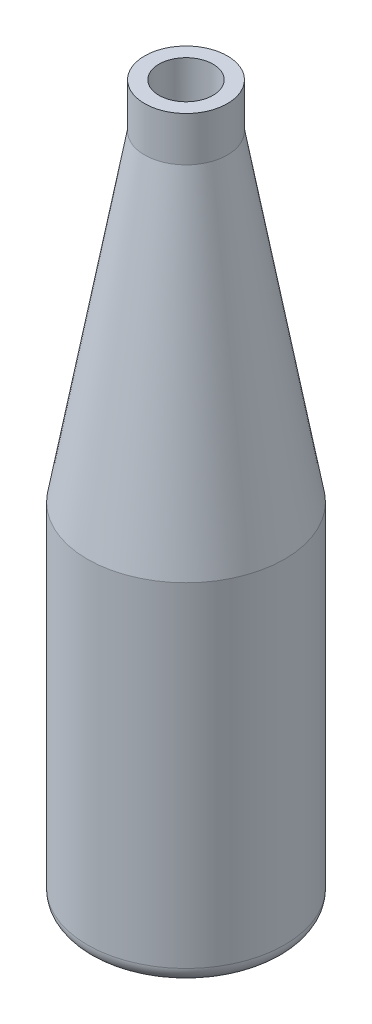
ISO-10303-21;
HEADER;
FILE_DESCRIPTION(('STEP AP214'),'2;1');
FILE_NAME('part.step','',(''),(''),'','','');
FILE_SCHEMA(('AUTOMOTIVE_DESIGN { 1 0 10303 214 1 1 1 1 }'));
ENDSEC;
DATA;
#1=APPLICATION_CONTEXT('core data for automotive mechanical design processes');
#2=APPLICATION_PROTOCOL_DEFINITION('international standard','automotive_design',2000,#1);
#3=PRODUCT_CONTEXT('',#1,'mechanical');
#4=PRODUCT('Part','Part','',(#3));
#5=PRODUCT_RELATED_PRODUCT_CATEGORY('part','',(#4));
#6=PRODUCT_DEFINITION_FORMATION('','',#4);
#7=PRODUCT_DEFINITION_CONTEXT('part definition',#1,'design');
#8=PRODUCT_DEFINITION('design','',#6,#7);
#9=PRODUCT_DEFINITION_SHAPE('','',#8);
#10=(LENGTH_UNIT() NAMED_UNIT(*) SI_UNIT(.MILLI.,.METRE.));
#11=(NAMED_UNIT(*) PLANE_ANGLE_UNIT() SI_UNIT($,.RADIAN.));
#12=(NAMED_UNIT(*) SI_UNIT($,.STERADIAN.) SOLID_ANGLE_UNIT());
#13=UNCERTAINTY_MEASURE_WITH_UNIT(LENGTH_MEASURE(1.E-05),#10,'distance_accuracy_value','');
#14=(GEOMETRIC_REPRESENTATION_CONTEXT(3) GLOBAL_UNCERTAINTY_ASSIGNED_CONTEXT((#13)) GLOBAL_UNIT_ASSIGNED_CONTEXT((#10,
#11,#12)) REPRESENTATION_CONTEXT('',''));
#15=CARTESIAN_POINT('',(0.,0.,0.));
#16=DIRECTION('',(0.,0.,1.));
#17=DIRECTION('',(1.,0.,0.));
#18=AXIS2_PLACEMENT_3D('',#15,#16,#17);
#19=CARTESIAN_POINT('',(0.,225.,0.));
#20=DIRECTION('',(0.,1.,0.));
#21=DIRECTION('',(-1.,0.,0.));
#22=AXIS2_PLACEMENT_3D('',#19,#20,#21);
#23=CYLINDRICAL_SURFACE('',#22,31.);
#24=CARTESIAN_POINT('',(0.,110.,0.));
#25=DIRECTION('',(0.,1.,0.));
#26=DIRECTION('',(-1.,0.,0.));
#27=AXIS2_PLACEMENT_3D('',#24,#25,#26);
#28=CIRCLE('',#27,31.);
#29=CARTESIAN_POINT('',(-31.,110.,0.));
#30=VERTEX_POINT('',#29);
#31=EDGE_CURVE('E10',#30,#30,#28,.T.);
#32=ORIENTED_EDGE('',*,*,#31,.F.);
#33=EDGE_LOOP('',(#32));
#34=FACE_BOUND('',#33,.T.);
#35=CARTESIAN_POINT('',(0.,5.,0.));
#36=DIRECTION('',(0.,1.,0.));
#37=DIRECTION('',(-1.,0.,0.));
#38=AXIS2_PLACEMENT_3D('',#35,#36,#37);
#39=CIRCLE('',#38,31.);
#40=CARTESIAN_POINT('',(-31.,5.,0.));
#41=VERTEX_POINT('',#40);
#42=EDGE_CURVE('E80',#41,#41,#39,.T.);
#43=ORIENTED_EDGE('',*,*,#42,.T.);
#44=EDGE_LOOP('',(#43));
#45=FACE_BOUND('',#44,.T.);
#46=ADVANCED_FACE('F37',(#34,#45),#23,.T.);
#47=CARTESIAN_POINT('',(0.,110.,0.));
#48=DIRECTION('',(0.,-1.,0.));
#49=DIRECTION('',(1.,0.,0.));
#50=AXIS2_PLACEMENT_3D('',#47,#48,#49);
#51=CONICAL_SURFACE('',#50,31.,0.176366155603672);
#52=CARTESIAN_POINT('',(0.,211.,0.));
#53=DIRECTION('',(0.,1.,0.));
#54=DIRECTION('',(-1.,0.,0.));
#55=AXIS2_PLACEMENT_3D('',#52,#53,#54);
#56=CIRCLE('',#55,13.);
#57=CARTESIAN_POINT('',(-13.,211.,0.));
#58=VERTEX_POINT('',#57);
#59=EDGE_CURVE('E44',#58,#58,#56,.T.);
#60=ORIENTED_EDGE('',*,*,#59,.F.);
#61=EDGE_LOOP('',(#60));
#62=FACE_BOUND('',#61,.T.);
#63=ORIENTED_EDGE('',*,*,#31,.T.);
#64=EDGE_LOOP('',(#63));
#65=FACE_BOUND('',#64,.T.);
#66=ADVANCED_FACE('F103',(#62,#65),#51,.T.);
#67=CARTESIAN_POINT('',(0.,225.,0.));
#68=DIRECTION('',(0.,1.,0.));
#69=DIRECTION('',(-1.,0.,0.));
#70=AXIS2_PLACEMENT_3D('',#67,#68,#69);
#71=CYLINDRICAL_SURFACE('',#70,13.);
#72=CARTESIAN_POINT('',(0.,225.,0.));
#73=DIRECTION('',(0.,1.,0.));
#74=DIRECTION('',(-1.,0.,0.));
#75=AXIS2_PLACEMENT_3D('',#72,#73,#74);
#76=CIRCLE('',#75,13.);
#77=CARTESIAN_POINT('',(-13.,225.,0.));
#78=VERTEX_POINT('',#77);
#79=EDGE_CURVE('E49',#78,#78,#76,.T.);
#80=ORIENTED_EDGE('',*,*,#79,.F.);
#81=EDGE_LOOP('',(#80));
#82=FACE_BOUND('',#81,.T.);
#83=ORIENTED_EDGE('',*,*,#59,.T.);
#84=EDGE_LOOP('',(#83));
#85=FACE_BOUND('',#84,.T.);
#86=ADVANCED_FACE('F108',(#82,#85),#71,.T.);
#87=CARTESIAN_POINT('',(-13.,225.,0.));
#88=DIRECTION('',(0.,-1.,0.));
#89=DIRECTION('',(1.,0.,0.));
#90=AXIS2_PLACEMENT_3D('',#87,#88,#89);
#91=PLANE('',#90);
#92=CARTESIAN_POINT('',(0.,225.,0.));
#93=DIRECTION('',(0.,1.,0.));
#94=DIRECTION('',(-1.,0.,0.));
#95=AXIS2_PLACEMENT_3D('',#92,#93,#94);
#96=CIRCLE('',#95,8.49999999999999);
#97=CARTESIAN_POINT('',(-8.5,225.,0.));
#98=VERTEX_POINT('',#97);
#99=EDGE_CURVE('E54',#98,#98,#96,.T.);
#100=ORIENTED_EDGE('',*,*,#99,.F.);
#101=EDGE_LOOP('',(#100));
#102=FACE_BOUND('',#101,.T.);
#103=ORIENTED_EDGE('',*,*,#79,.T.);
#104=EDGE_LOOP('',(#103));
#105=FACE_BOUND('',#104,.T.);
#106=ADVANCED_FACE('F113',(#102,#105),#91,.F.);
#107=CARTESIAN_POINT('',(0.,225.,0.));
#108=DIRECTION('',(0.,1.,0.));
#109=DIRECTION('',(-1.,0.,0.));
#110=AXIS2_PLACEMENT_3D('',#107,#108,#109);
#111=CYLINDRICAL_SURFACE('',#110,8.49999999999999);
#112=ORIENTED_EDGE('',*,*,#99,.T.);
#113=EDGE_LOOP('',(#112));
#114=FACE_BOUND('',#113,.T.);
#115=CARTESIAN_POINT('',(0.,210.602144339146,0.));
#116=DIRECTION('',(0.,1.,0.));
#117=DIRECTION('',(-1.,0.,0.));
#118=AXIS2_PLACEMENT_3D('',#115,#116,#117);
#119=CIRCLE('',#118,8.49999999999999);
#120=CARTESIAN_POINT('',(8.49999999999998,210.602144339146,0.));
#121=VERTEX_POINT('',#120);
#122=EDGE_CURVE('E60',#121,#121,#119,.T.);
#123=ORIENTED_EDGE('',*,*,#122,.F.);
#124=EDGE_LOOP('',(#123));
#125=FACE_BOUND('',#124,.T.);
#126=ADVANCED_FACE('F119',(#114,#125),#111,.F.);
#127=CARTESIAN_POINT('',(0.,109.602144339146,0.));
#128=DIRECTION('',(0.,-1.,0.));
#129=DIRECTION('',(1.,0.,0.));
#130=AXIS2_PLACEMENT_3D('',#127,#128,#129);
#131=CONICAL_SURFACE('',#130,26.5,0.176366155603672);
#132=CARTESIAN_POINT('',(0.,109.602144339146,0.));
#133=DIRECTION('',(0.,1.,0.));
#134=DIRECTION('',(-1.,0.,0.));
#135=AXIS2_PLACEMENT_3D('',#132,#133,#134);
#136=CIRCLE('',#135,26.5);
#137=CARTESIAN_POINT('',(26.5,109.602144339146,0.));
#138=VERTEX_POINT('',#137);
#139=EDGE_CURVE('E64',#138,#138,#136,.T.);
#140=CARTESIAN_POINT('',(8.49999999999998,210.602144339146,0.));
#141=CARTESIAN_POINT('',(8.68749999999998,209.550061005813,0.));
#142=CARTESIAN_POINT('',(8.87499999999998,208.497977672479,0.));
#143=CARTESIAN_POINT('',(9.24999999999998,206.393811005813,0.));
#144=CARTESIAN_POINT('',(9.43749999999998,205.341727672479,0.));
#145=CARTESIAN_POINT('',(9.81249999999998,203.237561005813,0.));
#146=CARTESIAN_POINT('',(9.99999999999999,202.185477672479,0.));
#147=CARTESIAN_POINT('',(10.375,200.081311005813,0.));
#148=CARTESIAN_POINT('',(10.5625,199.029227672479,0.));
#149=CARTESIAN_POINT('',(10.9375,196.925061005813,0.));
#150=CARTESIAN_POINT('',(11.125,195.872977672479,0.));
#151=CARTESIAN_POINT('',(11.5,193.768811005813,0.));
#152=CARTESIAN_POINT('',(11.6875,192.716727672479,0.));
#153=CARTESIAN_POINT('',(12.0625,190.612561005813,0.));
#154=CARTESIAN_POINT('',(12.25,189.560477672479,0.));
#155=CARTESIAN_POINT('',(12.625,187.456311005813,0.));
#156=CARTESIAN_POINT('',(12.8125,186.404227672479,0.));
#157=CARTESIAN_POINT('',(13.1875,184.300061005813,0.));
#158=CARTESIAN_POINT('',(13.375,183.247977672479,0.));
#159=CARTESIAN_POINT('',(13.75,181.143811005813,0.));
#160=CARTESIAN_POINT('',(13.9375,180.091727672479,0.));
#161=CARTESIAN_POINT('',(14.3125,177.987561005813,0.));
#162=CARTESIAN_POINT('',(14.5,176.935477672479,0.));
#163=CARTESIAN_POINT('',(14.875,174.831311005813,0.));
#164=CARTESIAN_POINT('',(15.0625,173.779227672479,0.));
#165=CARTESIAN_POINT('',(15.4375,171.675061005813,0.));
#166=CARTESIAN_POINT('',(15.625,170.622977672479,0.));
#167=CARTESIAN_POINT('',(16.,168.518811005813,0.));
#168=CARTESIAN_POINT('',(16.1875,167.466727672479,0.));
#169=CARTESIAN_POINT('',(16.5625,165.362561005813,0.));
#170=CARTESIAN_POINT('',(16.75,164.310477672479,0.));
#171=CARTESIAN_POINT('',(17.125,162.206311005813,0.));
#172=CARTESIAN_POINT('',(17.3125,161.154227672479,0.));
#173=CARTESIAN_POINT('',(17.6875,159.050061005813,0.));
#174=CARTESIAN_POINT('',(17.875,157.997977672479,0.));
#175=CARTESIAN_POINT('',(18.25,155.893811005813,0.));
#176=CARTESIAN_POINT('',(18.4375,154.841727672479,0.));
#177=CARTESIAN_POINT('',(18.8125,152.737561005813,0.));
#178=CARTESIAN_POINT('',(19.,151.685477672479,0.));
#179=CARTESIAN_POINT('',(19.375,149.581311005813,0.));
#180=CARTESIAN_POINT('',(19.5625,148.529227672479,0.));
#181=CARTESIAN_POINT('',(19.9375,146.425061005813,0.));
#182=CARTESIAN_POINT('',(20.125,145.372977672479,0.));
#183=CARTESIAN_POINT('',(20.5,143.268811005813,0.));
#184=CARTESIAN_POINT('',(20.6875,142.216727672479,0.));
#185=CARTESIAN_POINT('',(21.0625,140.112561005813,0.));
#186=CARTESIAN_POINT('',(21.25,139.060477672479,0.));
#187=CARTESIAN_POINT('',(21.625,136.956311005813,0.));
#188=CARTESIAN_POINT('',(21.8125,135.904227672479,0.));
#189=CARTESIAN_POINT('',(22.1875,133.800061005813,0.));
#190=CARTESIAN_POINT('',(22.375,132.747977672479,0.));
#191=CARTESIAN_POINT('',(22.75,130.643811005813,0.));
#192=CARTESIAN_POINT('',(22.9375,129.591727672479,0.));
#193=CARTESIAN_POINT('',(23.3125,127.487561005813,0.));
#194=CARTESIAN_POINT('',(23.5,126.435477672479,0.));
#195=CARTESIAN_POINT('',(23.875,124.331311005813,0.));
#196=CARTESIAN_POINT('',(24.0625,123.279227672479,0.));
#197=CARTESIAN_POINT('',(24.4375,121.175061005813,0.));
#198=CARTESIAN_POINT('',(24.625,120.122977672479,0.));
#199=CARTESIAN_POINT('',(25.,118.018811005813,0.));
#200=CARTESIAN_POINT('',(25.1875,116.966727672479,0.));
#201=CARTESIAN_POINT('',(25.5625,114.862561005813,0.));
#202=CARTESIAN_POINT('',(25.75,113.810477672479,0.));
#203=CARTESIAN_POINT('',(26.125,111.706311005813,0.));
#204=CARTESIAN_POINT('',(26.3125,110.654227672479,0.));
#205=CARTESIAN_POINT('',(26.5,109.602144339146,0.));
#206=B_SPLINE_CURVE_WITH_KNOTS('',3,(#140,#141,#142,#143,#144,#145,#146,#147,#148,#149,#150,
#151,#152,#153,#154,#155,#156,#157,#158,#159,#160,#161,#162,#163,#164,#165,#166,#167,#168,#169,
#170,#171,#172,#173,#174,#175,#176,#177,#178,#179,#180,#181,#182,#183,#184,#185,#186,#187,#188,
#189,#190,#191,#192,#193,#194,#195,#196,#197,#198,#199,#200,#201,#202,#203,#204,#205),
.UNSPECIFIED.,.F.,.F.,(4,2,2,2,2,2,2,2,2,2,2,2,2,2,2,2,2,2,2,2,2,2,2,2,2,2,2,2,2,2,2,2,4),(0.,
3.20598195760675,6.4119639152135,9.61794587282025,12.823927830427,16.0299097880337,
19.2358917456405,22.4418737032473,25.647855660854,28.8538376184608,32.0598195760675,
35.2658015336743,38.471783491281,41.6777654488878,44.8837474064945,48.0897293641013,
51.295711321708,54.5016932793148,57.7076752369215,60.9136571945283,64.119639152135,
67.3256211097418,70.5316030673485,73.7375850249553,76.943566982562,80.1495489401688,
83.3555308977756,86.5615128553823,89.7674948129891,92.9734767705958,96.1794587282026,
99.3854406858093,102.591422643416),.UNSPECIFIED.);
#207=EDGE_CURVE('BSEAM123',#121,#138,#206,.T.);
#208=ORIENTED_EDGE('',*,*,#122,.T.);
#209=ORIENTED_EDGE('',*,*,#139,.F.);
#210=ORIENTED_EDGE('',*,*,#207,.T.);
#211=ORIENTED_EDGE('',*,*,#207,.F.);
#212=EDGE_LOOP('',(#208,#210,#209,#211));
#213=FACE_BOUND('',#212,.T.);
#214=ADVANCED_FACE('F123',(#213),#131,.F.);
#215=CARTESIAN_POINT('',(0.,225.,0.));
#216=DIRECTION('',(0.,1.,0.));
#217=DIRECTION('',(-1.,0.,0.));
#218=AXIS2_PLACEMENT_3D('',#215,#216,#217);
#219=CYLINDRICAL_SURFACE('',#218,26.5);
#220=ORIENTED_EDGE('',*,*,#139,.T.);
#221=EDGE_LOOP('',(#220));
#222=FACE_BOUND('',#221,.T.);
#223=CARTESIAN_POINT('',(0.,5.,0.));
#224=DIRECTION('',(0.,1.,0.));
#225=DIRECTION('',(-1.,0.,0.));
#226=AXIS2_PLACEMENT_3D('',#223,#224,#225);
#227=CIRCLE('',#226,26.5);
#228=CARTESIAN_POINT('',(-26.5,5.,0.));
#229=VERTEX_POINT('',#228);
#230=EDGE_CURVE('E68',#229,#229,#227,.T.);
#231=ORIENTED_EDGE('',*,*,#230,.F.);
#232=EDGE_LOOP('',(#231));
#233=FACE_BOUND('',#232,.T.);
#234=ADVANCED_FACE('F127',(#222,#233),#219,.F.);
#235=CARTESIAN_POINT('',(0.,5.,0.));
#236=DIRECTION('',(0.,1.,0.));
#237=DIRECTION('',(-1.,0.,0.));
#238=AXIS2_PLACEMENT_3D('',#235,#236,#237);
#239=TOROIDAL_SURFACE('',#238,26.,0.5);
#240=ORIENTED_EDGE('',*,*,#230,.T.);
#241=EDGE_LOOP('',(#240));
#242=FACE_BOUND('',#241,.T.);
#243=CARTESIAN_POINT('',(0.,4.5,0.));
#244=DIRECTION('',(0.,1.,0.));
#245=DIRECTION('',(-1.,0.,0.));
#246=AXIS2_PLACEMENT_3D('',#243,#244,#245);
#247=CIRCLE('',#246,26.);
#248=CARTESIAN_POINT('',(-26.,4.5,0.));
#249=VERTEX_POINT('',#248);
#250=EDGE_CURVE('E72',#249,#249,#247,.T.);
#251=ORIENTED_EDGE('',*,*,#250,.F.);
#252=EDGE_LOOP('',(#251));
#253=FACE_BOUND('',#252,.T.);
#254=ADVANCED_FACE('F99',(#242,#253),#239,.F.);
#255=CARTESIAN_POINT('',(-4.50000000000001,4.5,0.));
#256=DIRECTION('',(0.,-1.,0.));
#257=DIRECTION('',(1.,0.,0.));
#258=AXIS2_PLACEMENT_3D('',#255,#256,#257);
#259=PLANE('',#258);
#260=ORIENTED_EDGE('',*,*,#250,.T.);
#261=EDGE_LOOP('',(#260));
#262=FACE_BOUND('',#261,.T.);
#263=ADVANCED_FACE('F94',(#262),#259,.F.);
#264=CARTESIAN_POINT('',(0.,0.,0.));
#265=DIRECTION('',(0.,1.,0.));
#266=DIRECTION('',(-1.,0.,0.));
#267=AXIS2_PLACEMENT_3D('',#264,#265,#266);
#268=PLANE('',#267);
#269=CARTESIAN_POINT('',(0.,0.,0.));
#270=DIRECTION('',(0.,1.,0.));
#271=DIRECTION('',(-1.,0.,0.));
#272=AXIS2_PLACEMENT_3D('',#269,#270,#271);
#273=CIRCLE('',#272,26.);
#274=CARTESIAN_POINT('',(-26.,0.,0.));
#275=VERTEX_POINT('',#274);
#276=EDGE_CURVE('E76',#275,#275,#273,.T.);
#277=ORIENTED_EDGE('',*,*,#276,.F.);
#278=EDGE_LOOP('',(#277));
#279=FACE_BOUND('',#278,.T.);
#280=ADVANCED_FACE('F89',(#279),#268,.F.);
#281=CARTESIAN_POINT('',(0.,5.,0.));
#282=DIRECTION('',(0.,1.,0.));
#283=DIRECTION('',(-1.,0.,0.));
#284=AXIS2_PLACEMENT_3D('',#281,#282,#283);
#285=TOROIDAL_SURFACE('',#284,26.,5.);
#286=ORIENTED_EDGE('',*,*,#42,.F.);
#287=EDGE_LOOP('',(#286));
#288=FACE_BOUND('',#287,.T.);
#289=ORIENTED_EDGE('',*,*,#276,.T.);
#290=EDGE_LOOP('',(#289));
#291=FACE_BOUND('',#290,.T.);
#292=ADVANCED_FACE('F86',(#288,#291),#285,.T.);
#293=CLOSED_SHELL('',(#46,#66,#86,#106,#126,#214,#234,#254,#263,#280,#292));
#294=MANIFOLD_SOLID_BREP('B2',#293);
#295=ADVANCED_BREP_SHAPE_REPRESENTATION('',(#18,#294),#14);
#296=SHAPE_DEFINITION_REPRESENTATION(#9,#295);
ENDSEC;
END-ISO-10303-21;
